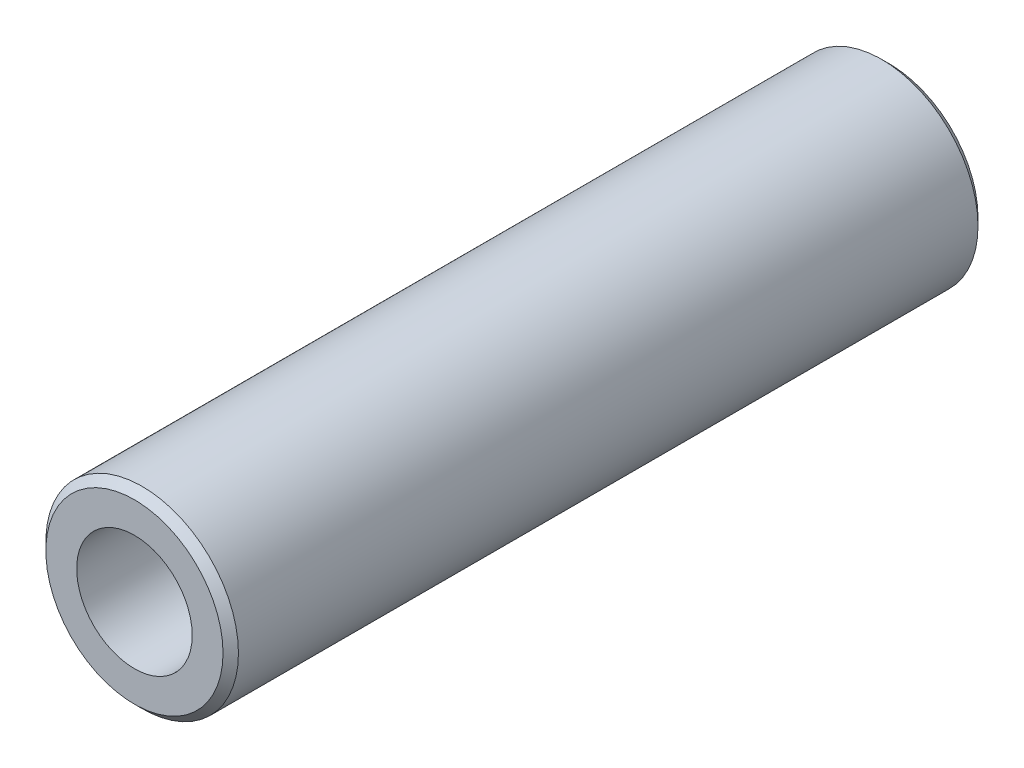
ISO-10303-21;
HEADER;
FILE_DESCRIPTION(('STEP AP214'),'2;1');
FILE_NAME('part.step','',(''),(''),'','','');
FILE_SCHEMA(('AUTOMOTIVE_DESIGN { 1 0 10303 214 1 1 1 1 }'));
ENDSEC;
DATA;
#1=APPLICATION_CONTEXT('core data for automotive mechanical design processes');
#2=APPLICATION_PROTOCOL_DEFINITION('international standard','automotive_design',2000,#1);
#3=PRODUCT_CONTEXT('',#1,'mechanical');
#4=PRODUCT('Part','Part','',(#3));
#5=PRODUCT_RELATED_PRODUCT_CATEGORY('part','',(#4));
#6=PRODUCT_DEFINITION_FORMATION('','',#4);
#7=PRODUCT_DEFINITION_CONTEXT('part definition',#1,'design');
#8=PRODUCT_DEFINITION('design','',#6,#7);
#9=PRODUCT_DEFINITION_SHAPE('','',#8);
#10=(LENGTH_UNIT() NAMED_UNIT(*) SI_UNIT(.MILLI.,.METRE.));
#11=(NAMED_UNIT(*) PLANE_ANGLE_UNIT() SI_UNIT($,.RADIAN.));
#12=(NAMED_UNIT(*) SI_UNIT($,.STERADIAN.) SOLID_ANGLE_UNIT());
#13=UNCERTAINTY_MEASURE_WITH_UNIT(LENGTH_MEASURE(1.E-05),#10,'distance_accuracy_value','');
#14=(GEOMETRIC_REPRESENTATION_CONTEXT(3) GLOBAL_UNCERTAINTY_ASSIGNED_CONTEXT((#13)) GLOBAL_UNIT_ASSIGNED_CONTEXT((#10,
#11,#12)) REPRESENTATION_CONTEXT('',''));
#15=CARTESIAN_POINT('',(0.,0.,0.));
#16=DIRECTION('',(0.,0.,1.));
#17=DIRECTION('',(1.,0.,0.));
#18=AXIS2_PLACEMENT_3D('',#15,#16,#17);
#19=CARTESIAN_POINT('',(0.,0.,24.5));
#20=DIRECTION('',(0.,0.,1.));
#21=DIRECTION('',(1.,0.,0.));
#22=AXIS2_PLACEMENT_3D('',#19,#20,#21);
#23=PLANE('',#22);
#24=CARTESIAN_POINT('',(0.,0.,24.5));
#25=DIRECTION('',(0.,0.,1.));
#26=DIRECTION('',(1.,0.,0.));
#27=AXIS2_PLACEMENT_3D('',#24,#25,#26);
#28=CIRCLE('',#27,5.75);
#29=CARTESIAN_POINT('',(5.75,0.,24.5));
#30=VERTEX_POINT('',#29);
#31=EDGE_CURVE('E68',#30,#30,#28,.T.);
#32=ORIENTED_EDGE('',*,*,#31,.T.);
#33=EDGE_LOOP('',(#32));
#34=FACE_BOUND('',#33,.T.);
#35=CARTESIAN_POINT('',(0.,0.,24.5));
#36=DIRECTION('',(0.,0.,1.));
#37=DIRECTION('',(1.,0.,0.));
#38=AXIS2_PLACEMENT_3D('',#35,#36,#37);
#39=CIRCLE('',#38,3.75);
#40=CARTESIAN_POINT('',(3.75,0.,24.5));
#41=VERTEX_POINT('',#40);
#42=EDGE_CURVE('E74',#41,#41,#39,.T.);
#43=ORIENTED_EDGE('',*,*,#42,.F.);
#44=EDGE_LOOP('',(#43));
#45=FACE_BOUND('',#44,.T.);
#46=ADVANCED_FACE('F49',(#34,#45),#23,.T.);
#47=CARTESIAN_POINT('',(0.,0.,-24.5));
#48=DIRECTION('',(0.,0.,1.));
#49=DIRECTION('',(1.,0.,0.));
#50=AXIS2_PLACEMENT_3D('',#47,#48,#49);
#51=PLANE('',#50);
#52=CARTESIAN_POINT('',(0.,0.,-24.5));
#53=DIRECTION('',(0.,0.,1.));
#54=DIRECTION('',(1.,0.,0.));
#55=AXIS2_PLACEMENT_3D('',#52,#53,#54);
#56=CIRCLE('',#55,5.74999999999998);
#57=CARTESIAN_POINT('',(5.74999999999998,0.,-24.5));
#58=VERTEX_POINT('',#57);
#59=EDGE_CURVE('E11',#58,#58,#56,.F.);
#60=ORIENTED_EDGE('',*,*,#59,.T.);
#61=EDGE_LOOP('',(#60));
#62=FACE_BOUND('',#61,.T.);
#63=CARTESIAN_POINT('',(0.,0.,-24.5));
#64=DIRECTION('',(0.,0.,1.));
#65=DIRECTION('',(1.,0.,0.));
#66=AXIS2_PLACEMENT_3D('',#63,#64,#65);
#67=CIRCLE('',#66,3.75);
#68=CARTESIAN_POINT('',(3.75,0.,-24.5));
#69=VERTEX_POINT('',#68);
#70=EDGE_CURVE('E75',#69,#69,#67,.T.);
#71=ORIENTED_EDGE('',*,*,#70,.T.);
#72=EDGE_LOOP('',(#71));
#73=FACE_BOUND('',#72,.T.);
#74=ADVANCED_FACE('F87',(#62,#73),#51,.F.);
#75=CARTESIAN_POINT('',(0.,0.,24.5));
#76=DIRECTION('',(0.,0.,-1.));
#77=DIRECTION('',(-1.,0.,0.));
#78=AXIS2_PLACEMENT_3D('',#75,#76,#77);
#79=CYLINDRICAL_SURFACE('',#78,6.25);
#80=CARTESIAN_POINT('',(0.,0.,-24.));
#81=DIRECTION('',(0.,0.,1.));
#82=DIRECTION('',(1.,0.,0.));
#83=AXIS2_PLACEMENT_3D('',#80,#81,#82);
#84=CIRCLE('',#83,6.25);
#85=CARTESIAN_POINT('',(6.25,0.,-24.));
#86=VERTEX_POINT('',#85);
#87=EDGE_CURVE('E58',#86,#86,#84,.T.);
#88=ORIENTED_EDGE('',*,*,#87,.T.);
#89=EDGE_LOOP('',(#88));
#90=FACE_BOUND('',#89,.T.);
#91=CARTESIAN_POINT('',(0.,0.,24.));
#92=DIRECTION('',(0.,0.,1.));
#93=DIRECTION('',(1.,0.,0.));
#94=AXIS2_PLACEMENT_3D('',#91,#92,#93);
#95=CIRCLE('',#94,6.25);
#96=CARTESIAN_POINT('',(6.25,0.,24.));
#97=VERTEX_POINT('',#96);
#98=EDGE_CURVE('E63',#97,#97,#95,.F.);
#99=ORIENTED_EDGE('',*,*,#98,.T.);
#100=EDGE_LOOP('',(#99));
#101=FACE_BOUND('',#100,.T.);
#102=ADVANCED_FACE('F93',(#90,#101),#79,.T.);
#103=CARTESIAN_POINT('',(0.,0.,24.5));
#104=DIRECTION('',(0.,0.,-1.));
#105=DIRECTION('',(-1.,0.,0.));
#106=AXIS2_PLACEMENT_3D('',#103,#104,#105);
#107=CYLINDRICAL_SURFACE('',#106,3.75);
#108=ORIENTED_EDGE('',*,*,#42,.T.);
#109=EDGE_LOOP('',(#108));
#110=FACE_BOUND('',#109,.T.);
#111=ORIENTED_EDGE('',*,*,#70,.F.);
#112=EDGE_LOOP('',(#111));
#113=FACE_BOUND('',#112,.T.);
#114=ADVANCED_FACE('F83',(#110,#113),#107,.F.);
#115=CARTESIAN_POINT('',(0.,0.,24.5));
#116=DIRECTION('',(0.,0.,-1.));
#117=DIRECTION('',(-1.,0.,0.));
#118=AXIS2_PLACEMENT_3D('',#115,#116,#117);
#119=CONICAL_SURFACE('',#118,5.75,0.785398163397447);
#120=ORIENTED_EDGE('',*,*,#98,.F.);
#121=EDGE_LOOP('',(#120));
#122=FACE_BOUND('',#121,.T.);
#123=ORIENTED_EDGE('',*,*,#31,.F.);
#124=EDGE_LOOP('',(#123));
#125=FACE_BOUND('',#124,.T.);
#126=ADVANCED_FACE('F99',(#122,#125),#119,.T.);
#127=CARTESIAN_POINT('',(0.,0.,-24.));
#128=DIRECTION('',(0.,0.,1.));
#129=DIRECTION('',(1.,0.,0.));
#130=AXIS2_PLACEMENT_3D('',#127,#128,#129);
#131=CONICAL_SURFACE('',#130,6.25,0.785398163397454);
#132=ORIENTED_EDGE('',*,*,#59,.F.);
#133=EDGE_LOOP('',(#132));
#134=FACE_BOUND('',#133,.T.);
#135=ORIENTED_EDGE('',*,*,#87,.F.);
#136=EDGE_LOOP('',(#135));
#137=FACE_BOUND('',#136,.T.);
#138=ADVANCED_FACE('F52',(#134,#137),#131,.T.);
#139=CLOSED_SHELL('',(#46,#74,#102,#114,#126,#138));
#140=MANIFOLD_SOLID_BREP('B2',#139);
#141=ADVANCED_BREP_SHAPE_REPRESENTATION('',(#18,#140),#14);
#142=SHAPE_DEFINITION_REPRESENTATION(#9,#141);
ENDSEC;
END-ISO-10303-21;
